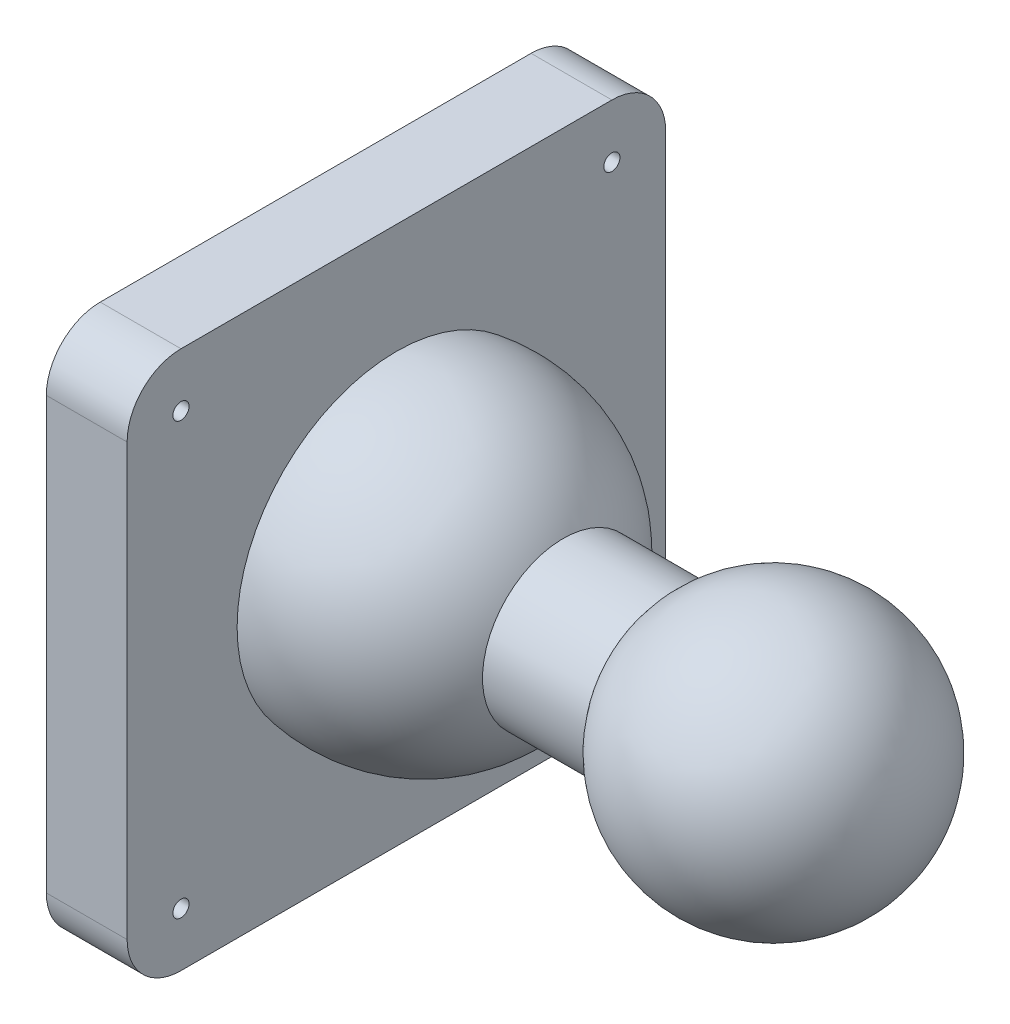
ISO-10303-21;
HEADER;
FILE_DESCRIPTION(('STEP AP214'),'2;1');
FILE_NAME('part.step','',(''),(''),'','','');
FILE_SCHEMA(('AUTOMOTIVE_DESIGN { 1 0 10303 214 1 1 1 1 }'));
ENDSEC;
DATA;
#1=APPLICATION_CONTEXT('core data for automotive mechanical design processes');
#2=APPLICATION_PROTOCOL_DEFINITION('international standard','automotive_design',2000,#1);
#3=PRODUCT_CONTEXT('',#1,'mechanical');
#4=PRODUCT('Part','Part','',(#3));
#5=PRODUCT_RELATED_PRODUCT_CATEGORY('part','',(#4));
#6=PRODUCT_DEFINITION_FORMATION('','',#4);
#7=PRODUCT_DEFINITION_CONTEXT('part definition',#1,'design');
#8=PRODUCT_DEFINITION('design','',#6,#7);
#9=PRODUCT_DEFINITION_SHAPE('','',#8);
#10=(LENGTH_UNIT() NAMED_UNIT(*) SI_UNIT(.MILLI.,.METRE.));
#11=(NAMED_UNIT(*) PLANE_ANGLE_UNIT() SI_UNIT($,.RADIAN.));
#12=(NAMED_UNIT(*) SI_UNIT($,.STERADIAN.) SOLID_ANGLE_UNIT());
#13=UNCERTAINTY_MEASURE_WITH_UNIT(LENGTH_MEASURE(1.E-05),#10,'distance_accuracy_value','');
#14=(GEOMETRIC_REPRESENTATION_CONTEXT(3) GLOBAL_UNCERTAINTY_ASSIGNED_CONTEXT((#13)) GLOBAL_UNIT_ASSIGNED_CONTEXT((#10,
#11,#12)) REPRESENTATION_CONTEXT('',''));
#15=CARTESIAN_POINT('',(0.,0.,0.));
#16=DIRECTION('',(0.,0.,1.));
#17=DIRECTION('',(1.,0.,0.));
#18=AXIS2_PLACEMENT_3D('',#15,#16,#17);
#19=CARTESIAN_POINT('',(65.,0.,0.));
#20=DIRECTION('',(-1.,0.,0.));
#21=DIRECTION('',(0.,0.,1.));
#22=AXIS2_PLACEMENT_3D('',#19,#20,#21);
#23=SPHERICAL_SURFACE('',#22,25.);
#24=CARTESIAN_POINT('',(45.,0.,0.));
#25=DIRECTION('',(-1.,0.,0.));
#26=DIRECTION('',(0.,0.,1.));
#27=AXIS2_PLACEMENT_3D('',#24,#25,#26);
#28=CIRCLE('',#27,15.);
#29=CARTESIAN_POINT('',(45.,0.,15.));
#30=VERTEX_POINT('',#29);
#31=EDGE_CURVE('E11',#30,#30,#28,.T.);
#32=ORIENTED_EDGE('',*,*,#31,.F.);
#33=EDGE_LOOP('',(#32));
#34=FACE_BOUND('',#33,.T.);
#35=ADVANCED_FACE('F55',(#34),#23,.T.);
#36=CARTESIAN_POINT('',(45.,0.,0.));
#37=DIRECTION('',(1.,0.,0.));
#38=DIRECTION('',(0.,0.,-1.));
#39=AXIS2_PLACEMENT_3D('',#36,#37,#38);
#40=PLANE('',#39);
#41=ORIENTED_EDGE('',*,*,#31,.T.);
#42=EDGE_LOOP('',(#41));
#43=FACE_BOUND('',#42,.T.);
#44=ADVANCED_FACE('F62',(#43),#40,.F.);
#45=CLOSED_SHELL('',(#35,#44));
#46=MANIFOLD_SOLID_BREP('B2',#45);
#47=CARTESIAN_POINT('',(0.,0.,0.));
#48=DIRECTION('',(-1.,0.,0.));
#49=DIRECTION('',(0.,0.,-1.));
#50=AXIS2_PLACEMENT_3D('',#47,#48,#49);
#51=SPHERICAL_SURFACE('',#50,30.);
#52=CARTESIAN_POINT('',(-5.,0.,0.));
#53=DIRECTION('',(-1.,0.,0.));
#54=DIRECTION('',(0.,0.,1.));
#55=AXIS2_PLACEMENT_3D('',#52,#53,#54);
#56=CIRCLE('',#55,29.5803989154981);
#57=CARTESIAN_POINT('',(-5.,0.,-29.5803989154981));
#58=VERTEX_POINT('',#57);
#59=EDGE_CURVE('E194',#58,#58,#56,.T.);
#60=CARTESIAN_POINT('',(25.9807621135332,0.,0.));
#61=DIRECTION('',(-1.,0.,0.));
#62=DIRECTION('',(0.,0.,1.));
#63=AXIS2_PLACEMENT_3D('',#60,#61,#62);
#64=CIRCLE('',#63,15.);
#65=CARTESIAN_POINT('',(25.9807621135332,0.,-15.));
#66=VERTEX_POINT('',#65);
#67=EDGE_CURVE('E203',#66,#66,#64,.F.);
#68=CARTESIAN_POINT('',(-5.,0.,-29.5803989154981));
#69=CARTESIAN_POINT('',(-4.62573275345598,0.,-29.6436654041968));
#70=CARTESIAN_POINT('',(-4.25026387478689,0.,-29.6998214713942));
#71=CARTESIAN_POINT('',(-3.49746587180432,0.,-29.7978480945122));
#72=CARTESIAN_POINT('',(-3.12013674749082,0.,-29.839718650433));
#73=CARTESIAN_POINT('',(-2.36416127182512,0.,-29.9091095827242));
#74=CARTESIAN_POINT('',(-1.98551492047291,0.,-29.9366299590947));
#75=CARTESIAN_POINT('',(-1.22745062502384,0.,-29.9772820514179));
#76=CARTESIAN_POINT('',(-0.848032680926981,0.,-29.9904137673706));
#77=CARTESIAN_POINT('',(-0.0889717534409535,0.,-30.0022693089011));
#78=CARTESIAN_POINT('',(0.290671229948214,0.,-30.0009931344789));
#79=CARTESIAN_POINT('',(1.0496353068167,0.,-29.9840348173984));
#80=CARTESIAN_POINT('',(1.42895640029602,0.,-29.9683526747401));
#81=CARTESIAN_POINT('',(2.18673024567542,0.,-29.9226049906549));
#82=CARTESIAN_POINT('',(2.5651829975755,0.,-29.892539449228));
#83=CARTESIAN_POINT('',(3.32067495536898,0.,-29.8180682863977));
#84=CARTESIAN_POINT('',(3.69771416126238,0.,-29.7736626649944));
#85=CARTESIAN_POINT('',(4.44983585997848,0.,-29.6705753118809));
#86=CARTESIAN_POINT('',(4.82491835280117,0.,-29.6118935801708));
#87=CARTESIAN_POINT('',(5.57258627691076,0.,-29.4803385444928));
#88=CARTESIAN_POINT('',(5.94517170819766,0.,-29.4074652405248));
#89=CARTESIAN_POINT('',(6.68730875813903,0.,-29.2476320423851));
#90=CARTESIAN_POINT('',(7.05686037679351,0.,-29.1606721482133));
#91=CARTESIAN_POINT('',(7.79239742090181,0.,-28.9727910451798));
#92=CARTESIAN_POINT('',(8.15838284635562,0.,-28.8718698363181));
#93=CARTESIAN_POINT('',(8.88626026100081,0.,-28.6562114922196));
#94=CARTESIAN_POINT('',(9.24815225019218,0.,-28.5414743569828));
#95=CARTESIAN_POINT('',(9.96732144630351,0.,-28.2983494518511));
#96=CARTESIAN_POINT('',(10.3245986532235,0.,-28.1699616819563));
#97=CARTESIAN_POINT('',(11.0340235868949,0.,-27.8997204644936));
#98=CARTESIAN_POINT('',(11.3861713136464,0.,-27.7578670169257));
#99=CARTESIAN_POINT('',(12.0848299786753,0.,-27.4608987999217));
#100=CARTESIAN_POINT('',(12.4313409169528,0.,-27.3057840304857));
#101=CARTESIAN_POINT('',(13.1182268171543,0.,-26.9825166299722));
#102=CARTESIAN_POINT('',(13.4586017790784,0.,-26.8143639988947));
#103=CARTESIAN_POINT('',(14.1327253782562,0.,-26.4652631178272));
#104=CARTESIAN_POINT('',(14.4664740155099,0.,-26.2843148678373));
#105=CARTESIAN_POINT('',(15.1268641629938,0.,-25.9098834251983));
#106=CARTESIAN_POINT('',(15.4535056732239,0.,-25.7164002325493));
#107=CARTESIAN_POINT('',(16.099211002922,0.,-25.3171776388372));
#108=CARTESIAN_POINT('',(16.4182748223899,0.,-25.111438237774));
#109=CARTESIAN_POINT('',(17.0483651233358,0.,-24.6879996179203));
#110=CARTESIAN_POINT('',(17.3593916048139,0.,-24.4703003991296));
#111=CARTESIAN_POINT('',(17.9729591612489,0.,-24.0232557639721));
#112=CARTESIAN_POINT('',(18.2755002362057,0.,-23.7939103476053));
#113=CARTESIAN_POINT('',(18.8716611352132,0.,-23.3239037150798));
#114=CARTESIAN_POINT('',(19.1652809592637,0.,-23.0832424989212));
#115=CARTESIAN_POINT('',(19.7431763642615,0.,-22.5909509663543));
#116=CARTESIAN_POINT('',(20.0274519452087,0.,-22.339320649946));
#117=CARTESIAN_POINT('',(20.5862493327661,0.,-21.8254534183477));
#118=CARTESIAN_POINT('',(20.8607711393764,0.,-21.5632165031577));
#119=CARTESIAN_POINT('',(21.3996655001747,0.,-21.0285138565552));
#120=CARTESIAN_POINT('',(21.6640380543627,0.,-20.7560481251427));
#121=CARTESIAN_POINT('',(22.1822530468667,0.,-20.2012803603218));
#122=CARTESIAN_POINT('',(22.4360954851826,0.,-19.9189783269134));
#123=CARTESIAN_POINT('',(22.9328845765687,0.,-19.344944657888));
#124=CARTESIAN_POINT('',(23.1758312296389,0.,-19.0532130222709));
#125=CARTESIAN_POINT('',(23.6504786872098,0.,-18.460740376048));
#126=CARTESIAN_POINT('',(23.8821794917105,0.,-18.1599993654421));
#127=CARTESIAN_POINT('',(24.3340017276665,0.,-17.549941388082));
#128=CARTESIAN_POINT('',(24.5541231591217,0.,-17.2406244213278));
#129=CARTESIAN_POINT('',(24.9824685446828,0.,-16.6138595116841));
#130=CARTESIAN_POINT('',(25.1906924987886,0.,-16.2964115687945));
#131=CARTESIAN_POINT('',(25.5949466719119,0.,-15.6538443616893));
#132=CARTESIAN_POINT('',(25.7909768909293,0.,-15.3287250974738));
#133=CARTESIAN_POINT('',(25.9807621135332,0.,-15.));
#134=B_SPLINE_CURVE_WITH_KNOTS('',3,(#68,#69,#70,#71,#72,#73,#74,#75,#76,#77,#78,#79,#80,#81,
#82,#83,#84,#85,#86,#87,#88,#89,#90,#91,#92,#93,#94,#95,#96,#97,#98,#99,#100,#101,#102,#103,
#104,#105,#106,#107,#108,#109,#110,#111,#112,#113,#114,#115,#116,#117,#118,#119,#120,#121,#122,
#123,#124,#125,#126,#127,#128,#129,#130,#131,#132,#133),.UNSPECIFIED.,.F.,.F.,(4,2,2,2,2,2,2,2,
2,2,2,2,2,2,2,2,2,2,2,2,2,2,2,2,2,2,2,2,2,2,2,2,4),(0.,1.13866191867599,2.27732383735198,
3.41598575602796,4.55464767470395,5.69330959337994,6.83197151205593,7.97063343073192,
9.1092953494079,10.2479572680839,11.3866191867599,12.5252811054359,13.6639430241119,
14.8026049427878,15.9412668614638,17.0799287801398,18.2185906988158,19.3572526174918,
20.4959145361678,21.6345764548438,22.7732383735198,23.9119002921957,25.0505622108717,
26.1892241295477,27.3278860482237,28.4665479668997,29.6052098855757,30.7438718042517,
31.8825337229277,33.0211956416036,34.1598575602796,35.2985194789556,36.4371813976316),.UNSPECIFIED.);
#135=EDGE_CURVE('BSEAM82',#58,#66,#134,.T.);
#136=ORIENTED_EDGE('',*,*,#59,.F.);
#137=ORIENTED_EDGE('',*,*,#67,.F.);
#138=ORIENTED_EDGE('',*,*,#135,.T.);
#139=ORIENTED_EDGE('',*,*,#135,.F.);
#140=EDGE_LOOP('',(#136,#138,#137,#139));
#141=FACE_BOUND('',#140,.T.);
#142=ADVANCED_FACE('F82',(#141),#51,.T.);
#143=CARTESIAN_POINT('',(-30.001,0.,0.));
#144=DIRECTION('',(1.,0.,0.));
#145=DIRECTION('',(0.,0.,-1.));
#146=AXIS2_PLACEMENT_3D('',#143,#144,#145);
#147=CYLINDRICAL_SURFACE('',#146,15.);
#148=ORIENTED_EDGE('',*,*,#67,.T.);
#149=EDGE_LOOP('',(#148));
#150=FACE_BOUND('',#149,.T.);
#151=CARTESIAN_POINT('',(45.,0.,0.));
#152=DIRECTION('',(-1.,0.,0.));
#153=DIRECTION('',(0.,0.,1.));
#154=AXIS2_PLACEMENT_3D('',#151,#152,#153);
#155=CIRCLE('',#154,15.);
#156=CARTESIAN_POINT('',(45.,0.,15.));
#157=VERTEX_POINT('',#156);
#158=EDGE_CURVE('E190',#157,#157,#155,.T.);
#159=ORIENTED_EDGE('',*,*,#158,.T.);
#160=EDGE_LOOP('',(#159));
#161=FACE_BOUND('',#160,.T.);
#162=ADVANCED_FACE('F305',(#150,#161),#147,.T.);
#163=CARTESIAN_POINT('',(45.,0.,0.));
#164=DIRECTION('',(-1.,0.,0.));
#165=DIRECTION('',(0.,0.,1.));
#166=AXIS2_PLACEMENT_3D('',#163,#164,#165);
#167=PLANE('',#166);
#168=ORIENTED_EDGE('',*,*,#158,.F.);
#169=EDGE_LOOP('',(#168));
#170=FACE_BOUND('',#169,.T.);
#171=ADVANCED_FACE('F311',(#170),#167,.F.);
#172=CARTESIAN_POINT('',(-20.,-50.,50.));
#173=DIRECTION('',(0.,0.,-1.));
#174=DIRECTION('',(-1.,0.,0.));
#175=AXIS2_PLACEMENT_3D('',#172,#173,#174);
#176=PLANE('',#175);
#177=DIRECTION('',(0.,1.,0.));
#178=VECTOR('',#177,1.);
#179=CARTESIAN_POINT('',(-5.,-50.,50.));
#180=LINE('',#179,#178);
#181=CARTESIAN_POINT('',(-5.,-40.,50.));
#182=VERTEX_POINT('',#181);
#183=CARTESIAN_POINT('',(-5.,40.,50.));
#184=VERTEX_POINT('',#183);
#185=EDGE_CURVE('E186',#182,#184,#180,.T.);
#186=ORIENTED_EDGE('',*,*,#185,.T.);
#187=DIRECTION('',(1.,0.,0.));
#188=VECTOR('',#187,1.);
#189=CARTESIAN_POINT('',(-20.,40.,50.));
#190=LINE('',#189,#188);
#191=CARTESIAN_POINT('',(-20.,40.,50.));
#192=VERTEX_POINT('',#191);
#193=EDGE_CURVE('E235',#184,#192,#190,.F.);
#194=ORIENTED_EDGE('',*,*,#193,.T.);
#195=DIRECTION('',(0.,1.,0.));
#196=VECTOR('',#195,1.);
#197=CARTESIAN_POINT('',(-20.,-50.,50.));
#198=LINE('',#197,#196);
#199=CARTESIAN_POINT('',(-20.,-40.,50.));
#200=VERTEX_POINT('',#199);
#201=EDGE_CURVE('E184',#200,#192,#198,.T.);
#202=ORIENTED_EDGE('',*,*,#201,.F.);
#203=DIRECTION('',(1.,0.,0.));
#204=VECTOR('',#203,1.);
#205=CARTESIAN_POINT('',(-20.,-40.,50.));
#206=LINE('',#205,#204);
#207=EDGE_CURVE('E231',#200,#182,#206,.T.);
#208=ORIENTED_EDGE('',*,*,#207,.T.);
#209=EDGE_LOOP('',(#186,#194,#202,#208));
#210=FACE_BOUND('',#209,.T.);
#211=ADVANCED_FACE('F316',(#210),#176,.F.);
#212=CARTESIAN_POINT('',(-20.,50.,-50.));
#213=DIRECTION('',(0.,-1.,0.));
#214=DIRECTION('',(0.,0.,-1.));
#215=AXIS2_PLACEMENT_3D('',#212,#213,#214);
#216=PLANE('',#215);
#217=DIRECTION('',(0.,0.,-1.));
#218=VECTOR('',#217,1.);
#219=CARTESIAN_POINT('',(-5.,50.,-50.));
#220=LINE('',#219,#218);
#221=CARTESIAN_POINT('',(-5.,50.,40.));
#222=VERTEX_POINT('',#221);
#223=CARTESIAN_POINT('',(-5.,50.,-40.));
#224=VERTEX_POINT('',#223);
#225=EDGE_CURVE('E180',#222,#224,#220,.T.);
#226=ORIENTED_EDGE('',*,*,#225,.T.);
#227=DIRECTION('',(1.,0.,0.));
#228=VECTOR('',#227,1.);
#229=CARTESIAN_POINT('',(-20.,50.,-40.));
#230=LINE('',#229,#228);
#231=CARTESIAN_POINT('',(-20.,50.,-40.));
#232=VERTEX_POINT('',#231);
#233=EDGE_CURVE('E155',#224,#232,#230,.F.);
#234=ORIENTED_EDGE('',*,*,#233,.T.);
#235=DIRECTION('',(0.,0.,-1.));
#236=VECTOR('',#235,1.);
#237=CARTESIAN_POINT('',(-20.,50.,-50.));
#238=LINE('',#237,#236);
#239=CARTESIAN_POINT('',(-20.,50.,40.));
#240=VERTEX_POINT('',#239);
#241=EDGE_CURVE('E242',#240,#232,#238,.T.);
#242=ORIENTED_EDGE('',*,*,#241,.F.);
#243=DIRECTION('',(1.,0.,0.));
#244=VECTOR('',#243,1.);
#245=CARTESIAN_POINT('',(-20.,50.,40.));
#246=LINE('',#245,#244);
#247=EDGE_CURVE('E161',#240,#222,#246,.T.);
#248=ORIENTED_EDGE('',*,*,#247,.T.);
#249=EDGE_LOOP('',(#226,#234,#242,#248));
#250=FACE_BOUND('',#249,.T.);
#251=ADVANCED_FACE('F321',(#250),#216,.F.);
#252=CARTESIAN_POINT('',(-20.,-50.,-50.));
#253=DIRECTION('',(0.,0.,1.));
#254=DIRECTION('',(1.,0.,0.));
#255=AXIS2_PLACEMENT_3D('',#252,#253,#254);
#256=PLANE('',#255);
#257=DIRECTION('',(0.,-1.,0.));
#258=VECTOR('',#257,1.);
#259=CARTESIAN_POINT('',(-20.,-50.,-50.));
#260=LINE('',#259,#258);
#261=CARTESIAN_POINT('',(-20.,40.,-50.));
#262=VERTEX_POINT('',#261);
#263=CARTESIAN_POINT('',(-20.,-40.,-50.));
#264=VERTEX_POINT('',#263);
#265=EDGE_CURVE('E170',#262,#264,#260,.T.);
#266=ORIENTED_EDGE('',*,*,#265,.F.);
#267=DIRECTION('',(1.,0.,0.));
#268=VECTOR('',#267,1.);
#269=CARTESIAN_POINT('',(-20.,40.,-50.));
#270=LINE('',#269,#268);
#271=CARTESIAN_POINT('',(-5.,40.,-50.));
#272=VERTEX_POINT('',#271);
#273=EDGE_CURVE('E154',#262,#272,#270,.T.);
#274=ORIENTED_EDGE('',*,*,#273,.T.);
#275=DIRECTION('',(0.,-1.,0.));
#276=VECTOR('',#275,1.);
#277=CARTESIAN_POINT('',(-5.,-50.,-50.));
#278=LINE('',#277,#276);
#279=CARTESIAN_POINT('',(-5.,-40.,-50.));
#280=VERTEX_POINT('',#279);
#281=EDGE_CURVE('E168',#272,#280,#278,.T.);
#282=ORIENTED_EDGE('',*,*,#281,.T.);
#283=DIRECTION('',(1.,0.,0.));
#284=VECTOR('',#283,1.);
#285=CARTESIAN_POINT('',(-20.,-40.,-50.));
#286=LINE('',#285,#284);
#287=EDGE_CURVE('E173',#280,#264,#286,.F.);
#288=ORIENTED_EDGE('',*,*,#287,.T.);
#289=EDGE_LOOP('',(#266,#274,#282,#288));
#290=FACE_BOUND('',#289,.T.);
#291=ADVANCED_FACE('F167',(#290),#256,.F.);
#292=CARTESIAN_POINT('',(-20.,-50.,-50.));
#293=DIRECTION('',(0.,1.,0.));
#294=DIRECTION('',(0.,0.,1.));
#295=AXIS2_PLACEMENT_3D('',#292,#293,#294);
#296=PLANE('',#295);
#297=DIRECTION('',(0.,0.,1.));
#298=VECTOR('',#297,1.);
#299=CARTESIAN_POINT('',(-20.,-50.,-50.));
#300=LINE('',#299,#298);
#301=CARTESIAN_POINT('',(-20.,-50.,-40.));
#302=VERTEX_POINT('',#301);
#303=CARTESIAN_POINT('',(-20.,-50.,40.));
#304=VERTEX_POINT('',#303);
#305=EDGE_CURVE('E195',#302,#304,#300,.T.);
#306=ORIENTED_EDGE('',*,*,#305,.F.);
#307=DIRECTION('',(1.,0.,0.));
#308=VECTOR('',#307,1.);
#309=CARTESIAN_POINT('',(-20.,-50.,-40.));
#310=LINE('',#309,#308);
#311=CARTESIAN_POINT('',(-5.,-50.,-40.));
#312=VERTEX_POINT('',#311);
#313=EDGE_CURVE('E53',#302,#312,#310,.T.);
#314=ORIENTED_EDGE('',*,*,#313,.T.);
#315=DIRECTION('',(0.,0.,1.));
#316=VECTOR('',#315,1.);
#317=CARTESIAN_POINT('',(-5.,-50.,-50.));
#318=LINE('',#317,#316);
#319=CARTESIAN_POINT('',(-5.,-50.,40.));
#320=VERTEX_POINT('',#319);
#321=EDGE_CURVE('E179',#312,#320,#318,.T.);
#322=ORIENTED_EDGE('',*,*,#321,.T.);
#323=DIRECTION('',(1.,0.,0.));
#324=VECTOR('',#323,1.);
#325=CARTESIAN_POINT('',(-20.,-50.,40.));
#326=LINE('',#325,#324);
#327=EDGE_CURVE('E92',#320,#304,#326,.F.);
#328=ORIENTED_EDGE('',*,*,#327,.T.);
#329=EDGE_LOOP('',(#306,#314,#322,#328));
#330=FACE_BOUND('',#329,.T.);
#331=ADVANCED_FACE('F348',(#330),#296,.F.);
#332=CARTESIAN_POINT('',(-20.,0.,0.));
#333=DIRECTION('',(1.,0.,0.));
#334=DIRECTION('',(0.,0.,-1.));
#335=AXIS2_PLACEMENT_3D('',#332,#333,#334);
#336=PLANE('',#335);
#337=CARTESIAN_POINT('',(-20.,-40.,40.));
#338=DIRECTION('',(1.,0.,0.));
#339=DIRECTION('',(0.,0.,1.));
#340=AXIS2_PLACEMENT_3D('',#337,#338,#339);
#341=CIRCLE('',#340,1.5);
#342=CARTESIAN_POINT('',(-20.,-40.,41.5));
#343=VERTEX_POINT('',#342);
#344=EDGE_CURVE('E268',#343,#343,#341,.T.);
#345=ORIENTED_EDGE('',*,*,#344,.T.);
#346=EDGE_LOOP('',(#345));
#347=FACE_BOUND('',#346,.T.);
#348=CARTESIAN_POINT('',(-20.,-40.,-40.));
#349=DIRECTION('',(1.,0.,0.));
#350=DIRECTION('',(0.,0.,-1.));
#351=AXIS2_PLACEMENT_3D('',#348,#349,#350);
#352=CIRCLE('',#351,1.5);
#353=CARTESIAN_POINT('',(-20.,-40.,-41.5));
#354=VERTEX_POINT('',#353);
#355=EDGE_CURVE('E276',#354,#354,#352,.T.);
#356=ORIENTED_EDGE('',*,*,#355,.T.);
#357=EDGE_LOOP('',(#356));
#358=FACE_BOUND('',#357,.T.);
#359=CARTESIAN_POINT('',(-20.,40.,-40.));
#360=DIRECTION('',(1.,0.,0.));
#361=DIRECTION('',(0.,0.,1.));
#362=AXIS2_PLACEMENT_3D('',#359,#360,#361);
#363=CIRCLE('',#362,1.5);
#364=CARTESIAN_POINT('',(-20.,40.,-38.5));
#365=VERTEX_POINT('',#364);
#366=EDGE_CURVE('E284',#365,#365,#363,.T.);
#367=ORIENTED_EDGE('',*,*,#366,.T.);
#368=EDGE_LOOP('',(#367));
#369=FACE_BOUND('',#368,.T.);
#370=CARTESIAN_POINT('',(-20.,40.,40.));
#371=DIRECTION('',(1.,0.,0.));
#372=DIRECTION('',(0.,0.,-1.));
#373=AXIS2_PLACEMENT_3D('',#370,#371,#372);
#374=CIRCLE('',#373,1.5);
#375=CARTESIAN_POINT('',(-20.,40.,38.5));
#376=VERTEX_POINT('',#375);
#377=EDGE_CURVE('E256',#376,#376,#374,.T.);
#378=ORIENTED_EDGE('',*,*,#377,.T.);
#379=EDGE_LOOP('',(#378));
#380=FACE_BOUND('',#379,.T.);
#381=ORIENTED_EDGE('',*,*,#241,.T.);
#382=CARTESIAN_POINT('',(-20.,40.,-40.));
#383=DIRECTION('',(1.,0.,0.));
#384=DIRECTION('',(0.,0.,-1.));
#385=AXIS2_PLACEMENT_3D('',#382,#383,#384);
#386=CIRCLE('',#385,10.);
#387=EDGE_CURVE('E228',#232,#262,#386,.F.);
#388=ORIENTED_EDGE('',*,*,#387,.T.);
#389=ORIENTED_EDGE('',*,*,#265,.T.);
#390=CARTESIAN_POINT('',(-20.,-40.,-40.));
#391=DIRECTION('',(1.,0.,0.));
#392=DIRECTION('',(0.,0.,-1.));
#393=AXIS2_PLACEMENT_3D('',#390,#391,#392);
#394=CIRCLE('',#393,10.);
#395=EDGE_CURVE('E105',#264,#302,#394,.F.);
#396=ORIENTED_EDGE('',*,*,#395,.T.);
#397=ORIENTED_EDGE('',*,*,#305,.T.);
#398=CARTESIAN_POINT('',(-20.,-40.,40.));
#399=DIRECTION('',(1.,0.,0.));
#400=DIRECTION('',(0.,0.,-1.));
#401=AXIS2_PLACEMENT_3D('',#398,#399,#400);
#402=CIRCLE('',#401,10.);
#403=EDGE_CURVE('E220',#304,#200,#402,.F.);
#404=ORIENTED_EDGE('',*,*,#403,.T.);
#405=ORIENTED_EDGE('',*,*,#201,.T.);
#406=CARTESIAN_POINT('',(-20.,40.,40.));
#407=DIRECTION('',(1.,0.,0.));
#408=DIRECTION('',(0.,0.,-1.));
#409=AXIS2_PLACEMENT_3D('',#406,#407,#408);
#410=CIRCLE('',#409,10.);
#411=EDGE_CURVE('E225',#192,#240,#410,.F.);
#412=ORIENTED_EDGE('',*,*,#411,.T.);
#413=EDGE_LOOP('',(#381,#388,#389,#396,#397,#404,#405,#412));
#414=FACE_BOUND('',#413,.T.);
#415=ADVANCED_FACE('F296',(#347,#358,#369,#380,#414),#336,.F.);
#416=CARTESIAN_POINT('',(-5.,0.,0.));
#417=DIRECTION('',(1.,0.,0.));
#418=DIRECTION('',(0.,0.,-1.));
#419=AXIS2_PLACEMENT_3D('',#416,#417,#418);
#420=PLANE('',#419);
#421=CARTESIAN_POINT('',(-5.,-40.,40.));
#422=DIRECTION('',(1.,0.,0.));
#423=DIRECTION('',(0.,0.,1.));
#424=AXIS2_PLACEMENT_3D('',#421,#422,#423);
#425=CIRCLE('',#424,1.5);
#426=CARTESIAN_POINT('',(-5.,-40.,41.5));
#427=VERTEX_POINT('',#426);
#428=EDGE_CURVE('E272',#427,#427,#425,.T.);
#429=ORIENTED_EDGE('',*,*,#428,.F.);
#430=EDGE_LOOP('',(#429));
#431=FACE_BOUND('',#430,.T.);
#432=CARTESIAN_POINT('',(-5.,-40.,-40.));
#433=DIRECTION('',(1.,0.,0.));
#434=DIRECTION('',(0.,0.,-1.));
#435=AXIS2_PLACEMENT_3D('',#432,#433,#434);
#436=CIRCLE('',#435,1.5);
#437=CARTESIAN_POINT('',(-5.,-40.,-41.5));
#438=VERTEX_POINT('',#437);
#439=EDGE_CURVE('E280',#438,#438,#436,.T.);
#440=ORIENTED_EDGE('',*,*,#439,.F.);
#441=EDGE_LOOP('',(#440));
#442=FACE_BOUND('',#441,.T.);
#443=CARTESIAN_POINT('',(-5.,40.,-40.));
#444=DIRECTION('',(1.,0.,0.));
#445=DIRECTION('',(0.,0.,1.));
#446=AXIS2_PLACEMENT_3D('',#443,#444,#445);
#447=CIRCLE('',#446,1.5);
#448=CARTESIAN_POINT('',(-5.,40.,-38.5));
#449=VERTEX_POINT('',#448);
#450=EDGE_CURVE('E266',#449,#449,#447,.T.);
#451=ORIENTED_EDGE('',*,*,#450,.F.);
#452=EDGE_LOOP('',(#451));
#453=FACE_BOUND('',#452,.T.);
#454=CARTESIAN_POINT('',(-5.,40.,40.));
#455=DIRECTION('',(1.,0.,0.));
#456=DIRECTION('',(0.,0.,-1.));
#457=AXIS2_PLACEMENT_3D('',#454,#455,#456);
#458=CIRCLE('',#457,1.5);
#459=CARTESIAN_POINT('',(-5.,40.,38.5));
#460=VERTEX_POINT('',#459);
#461=EDGE_CURVE('E252',#460,#460,#458,.T.);
#462=ORIENTED_EDGE('',*,*,#461,.F.);
#463=EDGE_LOOP('',(#462));
#464=FACE_BOUND('',#463,.T.);
#465=ORIENTED_EDGE('',*,*,#59,.T.);
#466=EDGE_LOOP('',(#465));
#467=FACE_BOUND('',#466,.T.);
#468=ORIENTED_EDGE('',*,*,#281,.F.);
#469=CARTESIAN_POINT('',(-5.,40.,-40.));
#470=DIRECTION('',(1.,0.,0.));
#471=DIRECTION('',(0.,0.,-1.));
#472=AXIS2_PLACEMENT_3D('',#469,#470,#471);
#473=CIRCLE('',#472,10.);
#474=EDGE_CURVE('E150',#272,#224,#473,.T.);
#475=ORIENTED_EDGE('',*,*,#474,.T.);
#476=ORIENTED_EDGE('',*,*,#225,.F.);
#477=CARTESIAN_POINT('',(-5.,40.,40.));
#478=DIRECTION('',(1.,0.,0.));
#479=DIRECTION('',(0.,0.,-1.));
#480=AXIS2_PLACEMENT_3D('',#477,#478,#479);
#481=CIRCLE('',#480,10.);
#482=EDGE_CURVE('E162',#222,#184,#481,.T.);
#483=ORIENTED_EDGE('',*,*,#482,.T.);
#484=ORIENTED_EDGE('',*,*,#185,.F.);
#485=CARTESIAN_POINT('',(-5.,-40.,40.));
#486=DIRECTION('',(1.,0.,0.));
#487=DIRECTION('',(0.,0.,-1.));
#488=AXIS2_PLACEMENT_3D('',#485,#486,#487);
#489=CIRCLE('',#488,10.);
#490=EDGE_CURVE('E172',#182,#320,#489,.T.);
#491=ORIENTED_EDGE('',*,*,#490,.T.);
#492=ORIENTED_EDGE('',*,*,#321,.F.);
#493=CARTESIAN_POINT('',(-5.,-40.,-40.));
#494=DIRECTION('',(1.,0.,0.));
#495=DIRECTION('',(0.,0.,-1.));
#496=AXIS2_PLACEMENT_3D('',#493,#494,#495);
#497=CIRCLE('',#496,10.);
#498=EDGE_CURVE('E177',#312,#280,#497,.T.);
#499=ORIENTED_EDGE('',*,*,#498,.T.);
#500=EDGE_LOOP('',(#468,#475,#476,#483,#484,#491,#492,#499));
#501=FACE_BOUND('',#500,.T.);
#502=ADVANCED_FACE('F175',(#431,#442,#453,#464,#467,#501),#420,.T.);
#503=CARTESIAN_POINT('',(-20.,40.,-40.));
#504=DIRECTION('',(1.,0.,0.));
#505=DIRECTION('',(0.,0.,-1.));
#506=AXIS2_PLACEMENT_3D('',#503,#504,#505);
#507=CYLINDRICAL_SURFACE('',#506,10.);
#508=ORIENTED_EDGE('',*,*,#387,.F.);
#509=ORIENTED_EDGE('',*,*,#233,.F.);
#510=ORIENTED_EDGE('',*,*,#474,.F.);
#511=ORIENTED_EDGE('',*,*,#273,.F.);
#512=EDGE_LOOP('',(#508,#509,#510,#511));
#513=FACE_BOUND('',#512,.T.);
#514=ADVANCED_FACE('F153',(#513),#507,.T.);
#515=CARTESIAN_POINT('',(-20.,40.,40.));
#516=DIRECTION('',(1.,0.,0.));
#517=DIRECTION('',(0.,0.,-1.));
#518=AXIS2_PLACEMENT_3D('',#515,#516,#517);
#519=CYLINDRICAL_SURFACE('',#518,10.);
#520=ORIENTED_EDGE('',*,*,#411,.F.);
#521=ORIENTED_EDGE('',*,*,#193,.F.);
#522=ORIENTED_EDGE('',*,*,#482,.F.);
#523=ORIENTED_EDGE('',*,*,#247,.F.);
#524=EDGE_LOOP('',(#520,#521,#522,#523));
#525=FACE_BOUND('',#524,.T.);
#526=ADVANCED_FACE('F336',(#525),#519,.T.);
#527=CARTESIAN_POINT('',(-20.,-40.,-40.));
#528=DIRECTION('',(1.,0.,0.));
#529=DIRECTION('',(0.,0.,-1.));
#530=AXIS2_PLACEMENT_3D('',#527,#528,#529);
#531=CYLINDRICAL_SURFACE('',#530,10.);
#532=ORIENTED_EDGE('',*,*,#395,.F.);
#533=ORIENTED_EDGE('',*,*,#287,.F.);
#534=ORIENTED_EDGE('',*,*,#498,.F.);
#535=ORIENTED_EDGE('',*,*,#313,.F.);
#536=EDGE_LOOP('',(#532,#533,#534,#535));
#537=FACE_BOUND('',#536,.T.);
#538=ADVANCED_FACE('F338',(#537),#531,.T.);
#539=CARTESIAN_POINT('',(-20.,-40.,40.));
#540=DIRECTION('',(1.,0.,0.));
#541=DIRECTION('',(0.,0.,-1.));
#542=AXIS2_PLACEMENT_3D('',#539,#540,#541);
#543=CYLINDRICAL_SURFACE('',#542,10.);
#544=ORIENTED_EDGE('',*,*,#403,.F.);
#545=ORIENTED_EDGE('',*,*,#327,.F.);
#546=ORIENTED_EDGE('',*,*,#490,.F.);
#547=ORIENTED_EDGE('',*,*,#207,.F.);
#548=EDGE_LOOP('',(#544,#545,#546,#547));
#549=FACE_BOUND('',#548,.T.);
#550=ADVANCED_FACE('F84',(#549),#543,.T.);
#551=CARTESIAN_POINT('',(-20.,40.,40.));
#552=DIRECTION('',(1.,0.,0.));
#553=DIRECTION('',(0.,0.,-1.));
#554=AXIS2_PLACEMENT_3D('',#551,#552,#553);
#555=CYLINDRICAL_SURFACE('',#554,1.5);
#556=ORIENTED_EDGE('',*,*,#377,.F.);
#557=EDGE_LOOP('',(#556));
#558=FACE_BOUND('',#557,.T.);
#559=ORIENTED_EDGE('',*,*,#461,.T.);
#560=EDGE_LOOP('',(#559));
#561=FACE_BOUND('',#560,.T.);
#562=ADVANCED_FACE('F345',(#558,#561),#555,.F.);
#563=CARTESIAN_POINT('',(-20.,40.,-40.));
#564=DIRECTION('',(1.,0.,0.));
#565=DIRECTION('',(0.,0.,-1.));
#566=AXIS2_PLACEMENT_3D('',#563,#564,#565);
#567=CYLINDRICAL_SURFACE('',#566,1.5);
#568=ORIENTED_EDGE('',*,*,#366,.F.);
#569=EDGE_LOOP('',(#568));
#570=FACE_BOUND('',#569,.T.);
#571=ORIENTED_EDGE('',*,*,#450,.T.);
#572=EDGE_LOOP('',(#571));
#573=FACE_BOUND('',#572,.T.);
#574=ADVANCED_FACE('F292',(#570,#573),#567,.F.);
#575=CARTESIAN_POINT('',(-20.,-40.,-40.));
#576=DIRECTION('',(1.,0.,0.));
#577=DIRECTION('',(0.,0.,-1.));
#578=AXIS2_PLACEMENT_3D('',#575,#576,#577);
#579=CYLINDRICAL_SURFACE('',#578,1.5);
#580=ORIENTED_EDGE('',*,*,#355,.F.);
#581=EDGE_LOOP('',(#580));
#582=FACE_BOUND('',#581,.T.);
#583=ORIENTED_EDGE('',*,*,#439,.T.);
#584=EDGE_LOOP('',(#583));
#585=FACE_BOUND('',#584,.T.);
#586=ADVANCED_FACE('F371',(#582,#585),#579,.F.);
#587=CARTESIAN_POINT('',(-20.,-40.,40.));
#588=DIRECTION('',(1.,0.,0.));
#589=DIRECTION('',(0.,0.,-1.));
#590=AXIS2_PLACEMENT_3D('',#587,#588,#589);
#591=CYLINDRICAL_SURFACE('',#590,1.5);
#592=ORIENTED_EDGE('',*,*,#344,.F.);
#593=EDGE_LOOP('',(#592));
#594=FACE_BOUND('',#593,.T.);
#595=ORIENTED_EDGE('',*,*,#428,.T.);
#596=EDGE_LOOP('',(#595));
#597=FACE_BOUND('',#596,.T.);
#598=ADVANCED_FACE('F368',(#594,#597),#591,.F.);
#599=CLOSED_SHELL('',(#142,#162,#171,#211,#251,#291,#331,#415,#502,#514,#526,#538,#550,#562,
#574,#586,#598));
#600=CARTESIAN_POINT('',(0.,0.,-25.));
#601=DIRECTION('',(1.,0.,0.));
#602=DIRECTION('',(0.,0.,-1.));
#603=AXIS2_PLACEMENT_3D('',#600,#601,#602);
#604=PLANE('',#603);
#605=CARTESIAN_POINT('',(0.,0.,0.));
#606=DIRECTION('',(-1.,0.,0.));
#607=DIRECTION('',(0.,0.,1.));
#608=AXIS2_PLACEMENT_3D('',#605,#606,#607);
#609=CIRCLE('',#608,25.);
#610=CARTESIAN_POINT('',(0.,0.,25.));
#611=VERTEX_POINT('',#610);
#612=EDGE_CURVE('E199',#611,#611,#609,.T.);
#613=ORIENTED_EDGE('',*,*,#612,.F.);
#614=EDGE_LOOP('',(#613));
#615=FACE_BOUND('',#614,.T.);
#616=ADVANCED_FACE('F328',(#615),#604,.T.);
#617=CARTESIAN_POINT('',(0.,0.,0.));
#618=DIRECTION('',(-1.,0.,0.));
#619=DIRECTION('',(0.,0.,1.));
#620=AXIS2_PLACEMENT_3D('',#617,#618,#619);
#621=SPHERICAL_SURFACE('',#620,25.);
#622=ORIENTED_EDGE('',*,*,#612,.T.);
#623=EDGE_LOOP('',(#622));
#624=FACE_BOUND('',#623,.T.);
#625=ADVANCED_FACE('F325',(#624),#621,.F.);
#626=CLOSED_SHELL('',(#616,#625));
#627=ORIENTED_CLOSED_SHELL('',*,#626,.T.);
#628=BREP_WITH_VOIDS('B6',#599,(#627));
#629=ADVANCED_BREP_SHAPE_REPRESENTATION('',(#18,#46,#628),#14);
#630=SHAPE_DEFINITION_REPRESENTATION(#9,#629);
ENDSEC;
END-ISO-10303-21;
